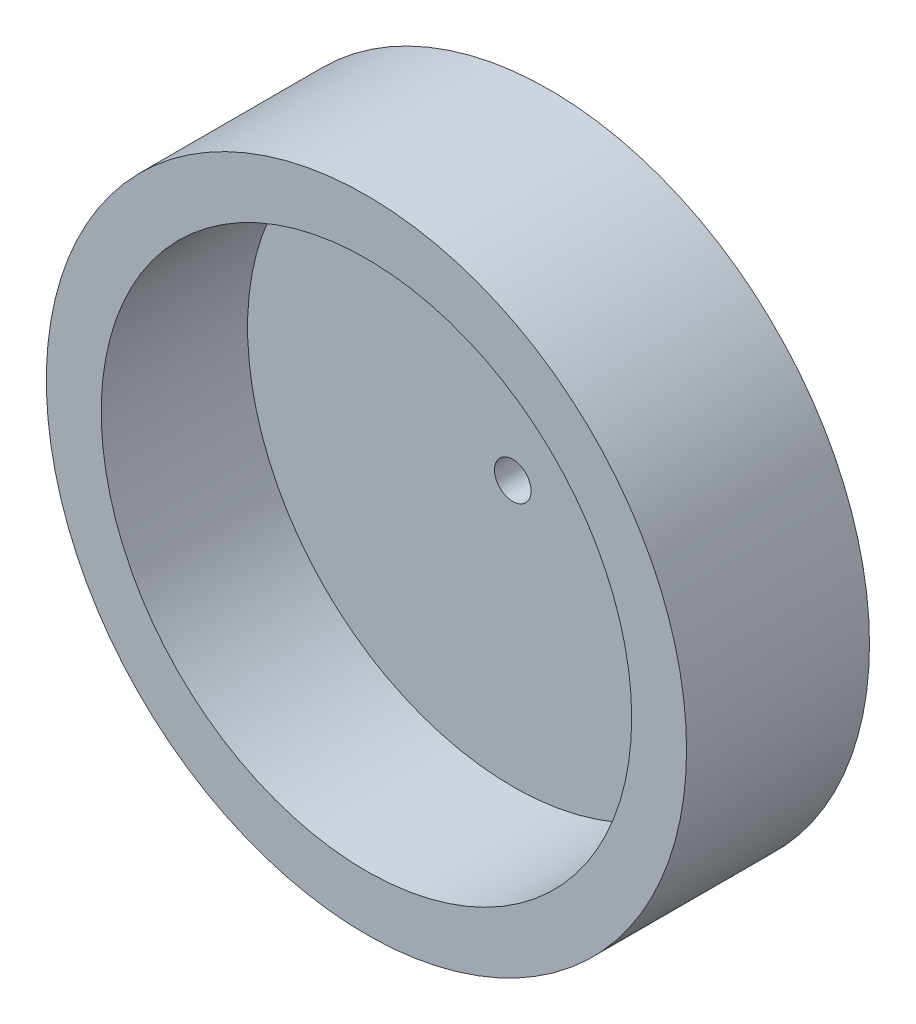
ISO-10303-21;
HEADER;
FILE_DESCRIPTION(('STEP AP214'),'2;1');
FILE_NAME('part.step','',(''),(''),'','','');
FILE_SCHEMA(('AUTOMOTIVE_DESIGN { 1 0 10303 214 1 1 1 1 }'));
ENDSEC;
DATA;
#1=APPLICATION_CONTEXT('core data for automotive mechanical design processes');
#2=APPLICATION_PROTOCOL_DEFINITION('international standard','automotive_design',2000,#1);
#3=PRODUCT_CONTEXT('',#1,'mechanical');
#4=PRODUCT('Part','Part','',(#3));
#5=PRODUCT_RELATED_PRODUCT_CATEGORY('part','',(#4));
#6=PRODUCT_DEFINITION_FORMATION('','',#4);
#7=PRODUCT_DEFINITION_CONTEXT('part definition',#1,'design');
#8=PRODUCT_DEFINITION('design','',#6,#7);
#9=PRODUCT_DEFINITION_SHAPE('','',#8);
#10=(LENGTH_UNIT() NAMED_UNIT(*) SI_UNIT(.MILLI.,.METRE.));
#11=(NAMED_UNIT(*) PLANE_ANGLE_UNIT() SI_UNIT($,.RADIAN.));
#12=(NAMED_UNIT(*) SI_UNIT($,.STERADIAN.) SOLID_ANGLE_UNIT());
#13=UNCERTAINTY_MEASURE_WITH_UNIT(LENGTH_MEASURE(1.E-05),#10,'distance_accuracy_value','');
#14=(GEOMETRIC_REPRESENTATION_CONTEXT(3) GLOBAL_UNCERTAINTY_ASSIGNED_CONTEXT((#13)) GLOBAL_UNIT_ASSIGNED_CONTEXT((#10,
#11,#12)) REPRESENTATION_CONTEXT('',''));
#15=CARTESIAN_POINT('',(0.,0.,0.));
#16=DIRECTION('',(0.,0.,1.));
#17=DIRECTION('',(1.,0.,0.));
#18=AXIS2_PLACEMENT_3D('',#15,#16,#17);
#19=CARTESIAN_POINT('',(0.,0.,2.));
#20=DIRECTION('',(0.,0.,-1.));
#21=DIRECTION('',(-1.,0.,0.));
#22=AXIS2_PLACEMENT_3D('',#19,#20,#21);
#23=CYLINDRICAL_SURFACE('',#22,17.5);
#24=CARTESIAN_POINT('',(0.,0.,0.));
#25=DIRECTION('',(0.,0.,1.));
#26=DIRECTION('',(1.,0.,0.));
#27=AXIS2_PLACEMENT_3D('',#24,#25,#26);
#28=CIRCLE('',#27,17.5);
#29=CARTESIAN_POINT('',(17.5,0.,0.));
#30=VERTEX_POINT('',#29);
#31=EDGE_CURVE('E43',#30,#30,#28,.T.);
#32=ORIENTED_EDGE('',*,*,#31,.T.);
#33=EDGE_LOOP('',(#32));
#34=FACE_BOUND('',#33,.T.);
#35=CARTESIAN_POINT('',(0.,0.,10.));
#36=DIRECTION('',(0.,0.,1.));
#37=DIRECTION('',(1.,0.,0.));
#38=AXIS2_PLACEMENT_3D('',#35,#36,#37);
#39=CIRCLE('',#38,17.5);
#40=CARTESIAN_POINT('',(17.5,0.,10.));
#41=VERTEX_POINT('',#40);
#42=EDGE_CURVE('E47',#41,#41,#39,.T.);
#43=ORIENTED_EDGE('',*,*,#42,.F.);
#44=EDGE_LOOP('',(#43));
#45=FACE_BOUND('',#44,.T.);
#46=ADVANCED_FACE('F37',(#34,#45),#23,.T.);
#47=CARTESIAN_POINT('',(0.,0.,0.));
#48=DIRECTION('',(0.,0.,1.));
#49=DIRECTION('',(1.,0.,0.));
#50=AXIS2_PLACEMENT_3D('',#47,#48,#49);
#51=PLANE('',#50);
#52=CARTESIAN_POINT('',(0.,0.,0.));
#53=DIRECTION('',(0.,0.,1.));
#54=DIRECTION('',(1.,0.,0.));
#55=AXIS2_PLACEMENT_3D('',#52,#53,#54);
#56=CIRCLE('',#55,1.);
#57=CARTESIAN_POINT('',(1.,0.,0.));
#58=VERTEX_POINT('',#57);
#59=EDGE_CURVE('E56',#58,#58,#56,.T.);
#60=ORIENTED_EDGE('',*,*,#59,.T.);
#61=EDGE_LOOP('',(#60));
#62=FACE_BOUND('',#61,.T.);
#63=ORIENTED_EDGE('',*,*,#31,.F.);
#64=EDGE_LOOP('',(#63));
#65=FACE_BOUND('',#64,.T.);
#66=ADVANCED_FACE('F63',(#62,#65),#51,.F.);
#67=CARTESIAN_POINT('',(0.,0.,10.));
#68=DIRECTION('',(0.,0.,1.));
#69=DIRECTION('',(1.,0.,0.));
#70=AXIS2_PLACEMENT_3D('',#67,#68,#69);
#71=PLANE('',#70);
#72=ORIENTED_EDGE('',*,*,#42,.T.);
#73=EDGE_LOOP('',(#72));
#74=FACE_BOUND('',#73,.T.);
#75=CARTESIAN_POINT('',(0.,0.,10.));
#76=DIRECTION('',(0.,0.,1.));
#77=DIRECTION('',(1.,0.,0.));
#78=AXIS2_PLACEMENT_3D('',#75,#76,#77);
#79=CIRCLE('',#78,14.5);
#80=CARTESIAN_POINT('',(14.5,0.,10.));
#81=VERTEX_POINT('',#80);
#82=EDGE_CURVE('E51',#81,#81,#79,.T.);
#83=ORIENTED_EDGE('',*,*,#82,.F.);
#84=EDGE_LOOP('',(#83));
#85=FACE_BOUND('',#84,.T.);
#86=ADVANCED_FACE('F80',(#74,#85),#71,.T.);
#87=CARTESIAN_POINT('',(0.,0.,10.));
#88=DIRECTION('',(0.,0.,-1.));
#89=DIRECTION('',(-1.,0.,0.));
#90=AXIS2_PLACEMENT_3D('',#87,#88,#89);
#91=CYLINDRICAL_SURFACE('',#90,14.5);
#92=ORIENTED_EDGE('',*,*,#82,.T.);
#93=EDGE_LOOP('',(#92));
#94=FACE_BOUND('',#93,.T.);
#95=CARTESIAN_POINT('',(0.,0.,2.));
#96=DIRECTION('',(0.,0.,1.));
#97=DIRECTION('',(1.,0.,0.));
#98=AXIS2_PLACEMENT_3D('',#95,#96,#97);
#99=CIRCLE('',#98,14.5);
#100=CARTESIAN_POINT('',(14.5,0.,2.));
#101=VERTEX_POINT('',#100);
#102=EDGE_CURVE('E10',#101,#101,#99,.F.);
#103=ORIENTED_EDGE('',*,*,#102,.T.);
#104=EDGE_LOOP('',(#103));
#105=FACE_BOUND('',#104,.T.);
#106=ADVANCED_FACE('F75',(#94,#105),#91,.F.);
#107=CARTESIAN_POINT('',(0.,0.,2.));
#108=DIRECTION('',(0.,0.,1.));
#109=DIRECTION('',(1.,0.,0.));
#110=AXIS2_PLACEMENT_3D('',#107,#108,#109);
#111=PLANE('',#110);
#112=CARTESIAN_POINT('',(0.,0.,2.));
#113=DIRECTION('',(0.,0.,1.));
#114=DIRECTION('',(1.,0.,0.));
#115=AXIS2_PLACEMENT_3D('',#112,#113,#114);
#116=CIRCLE('',#115,1.);
#117=CARTESIAN_POINT('',(1.,0.,2.));
#118=VERTEX_POINT('',#117);
#119=EDGE_CURVE('E57',#118,#118,#116,.T.);
#120=ORIENTED_EDGE('',*,*,#119,.F.);
#121=EDGE_LOOP('',(#120));
#122=FACE_BOUND('',#121,.T.);
#123=ORIENTED_EDGE('',*,*,#102,.F.);
#124=EDGE_LOOP('',(#123));
#125=FACE_BOUND('',#124,.T.);
#126=ADVANCED_FACE('F69',(#122,#125),#111,.T.);
#127=CARTESIAN_POINT('',(0.,0.,0.));
#128=DIRECTION('',(0.,0.,1.));
#129=DIRECTION('',(1.,0.,0.));
#130=AXIS2_PLACEMENT_3D('',#127,#128,#129);
#131=CYLINDRICAL_SURFACE('',#130,1.);
#132=ORIENTED_EDGE('',*,*,#59,.F.);
#133=EDGE_LOOP('',(#132));
#134=FACE_BOUND('',#133,.T.);
#135=ORIENTED_EDGE('',*,*,#119,.T.);
#136=EDGE_LOOP('',(#135));
#137=FACE_BOUND('',#136,.T.);
#138=ADVANCED_FACE('F66',(#134,#137),#131,.F.);
#139=CLOSED_SHELL('',(#46,#66,#86,#106,#126,#138));
#140=MANIFOLD_SOLID_BREP('B2',#139);
#141=ADVANCED_BREP_SHAPE_REPRESENTATION('',(#18,#140),#14);
#142=SHAPE_DEFINITION_REPRESENTATION(#9,#141);
ENDSEC;
END-ISO-10303-21;
